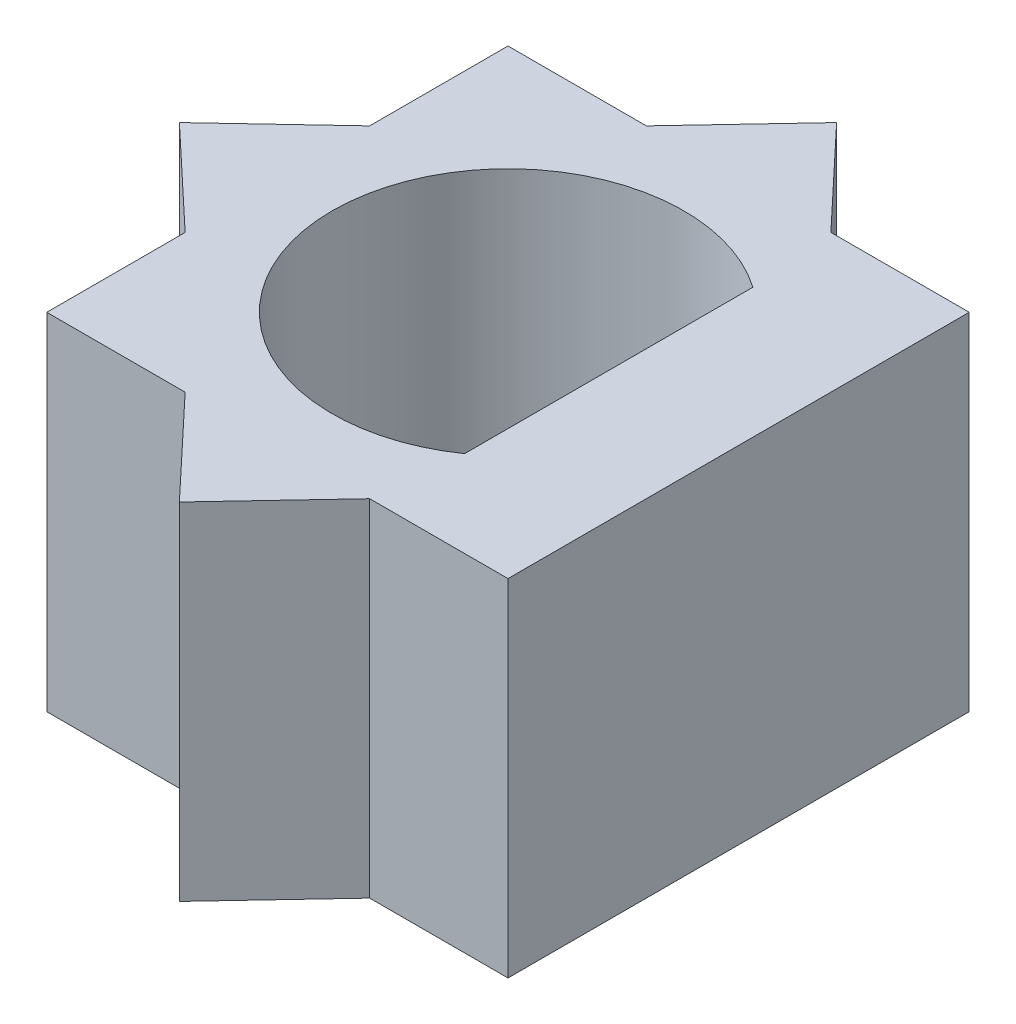
ISO-10303-21;
HEADER;
FILE_DESCRIPTION(('STEP AP214'),'2;1');
FILE_NAME('part.step','',(''),(''),'','','');
FILE_SCHEMA(('AUTOMOTIVE_DESIGN { 1 0 10303 214 1 1 1 1 }'));
ENDSEC;
DATA;
#1=APPLICATION_CONTEXT('core data for automotive mechanical design processes');
#2=APPLICATION_PROTOCOL_DEFINITION('international standard','automotive_design',2000,#1);
#3=PRODUCT_CONTEXT('',#1,'mechanical');
#4=PRODUCT('Part','Part','',(#3));
#5=PRODUCT_RELATED_PRODUCT_CATEGORY('part','',(#4));
#6=PRODUCT_DEFINITION_FORMATION('','',#4);
#7=PRODUCT_DEFINITION_CONTEXT('part definition',#1,'design');
#8=PRODUCT_DEFINITION('design','',#6,#7);
#9=PRODUCT_DEFINITION_SHAPE('','',#8);
#10=(LENGTH_UNIT() NAMED_UNIT(*) SI_UNIT(.MILLI.,.METRE.));
#11=(NAMED_UNIT(*) PLANE_ANGLE_UNIT() SI_UNIT($,.RADIAN.));
#12=(NAMED_UNIT(*) SI_UNIT($,.STERADIAN.) SOLID_ANGLE_UNIT());
#13=UNCERTAINTY_MEASURE_WITH_UNIT(LENGTH_MEASURE(1.E-05),#10,'distance_accuracy_value','');
#14=(GEOMETRIC_REPRESENTATION_CONTEXT(3) GLOBAL_UNCERTAINTY_ASSIGNED_CONTEXT((#13)) GLOBAL_UNIT_ASSIGNED_CONTEXT((#10,
#11,#12)) REPRESENTATION_CONTEXT('',''));
#15=CARTESIAN_POINT('',(0.,0.,0.));
#16=DIRECTION('',(0.,0.,1.));
#17=DIRECTION('',(1.,0.,0.));
#18=AXIS2_PLACEMENT_3D('',#15,#16,#17);
#19=CARTESIAN_POINT('',(-4.,6.,0.));
#20=DIRECTION('',(1.,0.,0.));
#21=DIRECTION('',(0.,0.,-1.));
#22=AXIS2_PLACEMENT_3D('',#19,#20,#21);
#23=PLANE('',#22);
#24=DIRECTION('',(0.,0.,1.));
#25=VECTOR('',#24,1.);
#26=CARTESIAN_POINT('',(-4.,0.,0.));
#27=LINE('',#26,#25);
#28=CARTESIAN_POINT('',(-4.00000000000003,0.,-3.99999999999992));
#29=VERTEX_POINT('',#28);
#30=CARTESIAN_POINT('',(-4.00000000000001,0.,-1.59999999999994));
#31=VERTEX_POINT('',#30);
#32=EDGE_CURVE('E185',#29,#31,#27,.T.);
#33=ORIENTED_EDGE('',*,*,#32,.T.);
#34=DIRECTION('',(0.,-1.,0.));
#35=VECTOR('',#34,1.);
#36=CARTESIAN_POINT('',(-4.00000000000001,6.,-1.59999999999994));
#37=LINE('',#36,#35);
#38=CARTESIAN_POINT('',(-4.00000000000001,6.,-1.59999999999994));
#39=VERTEX_POINT('',#38);
#40=EDGE_CURVE('E11',#39,#31,#37,.T.);
#41=ORIENTED_EDGE('',*,*,#40,.F.);
#42=DIRECTION('',(0.,0.,1.));
#43=VECTOR('',#42,1.);
#44=CARTESIAN_POINT('',(-4.,6.,0.));
#45=LINE('',#44,#43);
#46=CARTESIAN_POINT('',(-4.00000000000003,6.,-3.99999999999992));
#47=VERTEX_POINT('',#46);
#48=EDGE_CURVE('E236',#47,#39,#45,.T.);
#49=ORIENTED_EDGE('',*,*,#48,.F.);
#50=DIRECTION('',(0.,-1.,0.));
#51=VECTOR('',#50,1.);
#52=CARTESIAN_POINT('',(-4.00000000000003,6.,-3.99999999999992));
#53=LINE('',#52,#51);
#54=EDGE_CURVE('E56',#47,#29,#53,.T.);
#55=ORIENTED_EDGE('',*,*,#54,.T.);
#56=EDGE_LOOP('',(#33,#41,#49,#55));
#57=FACE_BOUND('',#56,.T.);
#58=ADVANCED_FACE('F37',(#57),#23,.F.);
#59=CARTESIAN_POINT('',(-2.67743119266045,6.,-2.84477064220183));
#60=DIRECTION('',(-0.685364699004978,0.,-0.728199992692815));
#61=DIRECTION('',(-0.728199992692815,0.,0.685364699004978));
#62=AXIS2_PLACEMENT_3D('',#59,#60,#61);
#63=PLANE('',#62);
#64=DIRECTION('',(0.728199992692815,0.,-0.685364699004978));
#65=VECTOR('',#64,1.);
#66=CARTESIAN_POINT('',(-2.67743119266045,0.,-2.84477064220183));
#67=LINE('',#66,#65);
#68=CARTESIAN_POINT('',(-5.70000000000001,0.,0.));
#69=VERTEX_POINT('',#68);
#70=EDGE_CURVE('E187',#69,#31,#67,.T.);
#71=ORIENTED_EDGE('',*,*,#70,.F.);
#72=DIRECTION('',(0.,-1.,0.));
#73=VECTOR('',#72,1.);
#74=CARTESIAN_POINT('',(-5.70000000000001,6.,0.));
#75=LINE('',#74,#73);
#76=CARTESIAN_POINT('',(-5.70000000000001,6.,0.));
#77=VERTEX_POINT('',#76);
#78=EDGE_CURVE('E47',#77,#69,#75,.T.);
#79=ORIENTED_EDGE('',*,*,#78,.F.);
#80=DIRECTION('',(0.728199992692815,0.,-0.685364699004978));
#81=VECTOR('',#80,1.);
#82=CARTESIAN_POINT('',(-2.67743119266045,6.,-2.84477064220183));
#83=LINE('',#82,#81);
#84=EDGE_CURVE('E239',#77,#39,#83,.T.);
#85=ORIENTED_EDGE('',*,*,#84,.T.);
#86=ORIENTED_EDGE('',*,*,#40,.T.);
#87=EDGE_LOOP('',(#71,#79,#85,#86));
#88=FACE_BOUND('',#87,.T.);
#89=ADVANCED_FACE('F245',(#88),#63,.T.);
#90=CARTESIAN_POINT('',(-2.67743119266062,6.,2.84477064220184));
#91=DIRECTION('',(0.685364699005,0.,-0.728199992692795));
#92=DIRECTION('',(-0.728199992692795,0.,-0.685364699005));
#93=AXIS2_PLACEMENT_3D('',#90,#91,#92);
#94=PLANE('',#93);
#95=DIRECTION('',(0.728199992692795,0.,0.685364699005));
#96=VECTOR('',#95,1.);
#97=CARTESIAN_POINT('',(-2.67743119266062,0.,2.84477064220184));
#98=LINE('',#97,#96);
#99=CARTESIAN_POINT('',(-3.99999999999999,0.,1.60000000000006));
#100=VERTEX_POINT('',#99);
#101=EDGE_CURVE('E191',#69,#100,#98,.T.);
#102=ORIENTED_EDGE('',*,*,#101,.T.);
#103=DIRECTION('',(0.,-1.,0.));
#104=VECTOR('',#103,1.);
#105=CARTESIAN_POINT('',(-3.99999999999999,6.,1.60000000000006));
#106=LINE('',#105,#104);
#107=CARTESIAN_POINT('',(-3.99999999999999,6.,1.60000000000006));
#108=VERTEX_POINT('',#107);
#109=EDGE_CURVE('E229',#108,#100,#106,.T.);
#110=ORIENTED_EDGE('',*,*,#109,.F.);
#111=DIRECTION('',(0.728199992692795,0.,0.685364699005));
#112=VECTOR('',#111,1.);
#113=CARTESIAN_POINT('',(-2.67743119266062,6.,2.84477064220184));
#114=LINE('',#113,#112);
#115=EDGE_CURVE('E247',#77,#108,#114,.T.);
#116=ORIENTED_EDGE('',*,*,#115,.F.);
#117=ORIENTED_EDGE('',*,*,#78,.T.);
#118=EDGE_LOOP('',(#102,#110,#116,#117));
#119=FACE_BOUND('',#118,.T.);
#120=ADVANCED_FACE('F295',(#119),#94,.F.);
#121=CARTESIAN_POINT('',(-3.99999999999997,0.,4.00000000000002));
#122=VERTEX_POINT('',#121);
#123=EDGE_CURVE('E188',#100,#122,#27,.T.);
#124=ORIENTED_EDGE('',*,*,#123,.T.);
#125=DIRECTION('',(0.,-1.,0.));
#126=VECTOR('',#125,1.);
#127=CARTESIAN_POINT('',(-3.99999999999997,6.,4.00000000000002));
#128=LINE('',#127,#126);
#129=CARTESIAN_POINT('',(-3.99999999999997,6.,4.00000000000002));
#130=VERTEX_POINT('',#129);
#131=EDGE_CURVE('E226',#130,#122,#128,.T.);
#132=ORIENTED_EDGE('',*,*,#131,.F.);
#133=EDGE_CURVE('E242',#108,#130,#45,.T.);
#134=ORIENTED_EDGE('',*,*,#133,.F.);
#135=ORIENTED_EDGE('',*,*,#109,.T.);
#136=EDGE_LOOP('',(#124,#132,#134,#135));
#137=FACE_BOUND('',#136,.T.);
#138=ADVANCED_FACE('F291',(#137),#23,.F.);
#139=CARTESIAN_POINT('',(0.,6.,4.00000000000001));
#140=DIRECTION('',(0.,0.,-1.));
#141=DIRECTION('',(-1.,0.,0.));
#142=AXIS2_PLACEMENT_3D('',#139,#140,#141);
#143=PLANE('',#142);
#144=DIRECTION('',(1.,0.,0.));
#145=VECTOR('',#144,1.);
#146=CARTESIAN_POINT('',(0.,0.,4.00000000000001));
#147=LINE('',#146,#145);
#148=CARTESIAN_POINT('',(-1.60000000000007,0.,4.00000000000001));
#149=VERTEX_POINT('',#148);
#150=EDGE_CURVE('E193',#122,#149,#147,.T.);
#151=ORIENTED_EDGE('',*,*,#150,.T.);
#152=DIRECTION('',(0.,-1.,0.));
#153=VECTOR('',#152,1.);
#154=CARTESIAN_POINT('',(-1.60000000000007,6.,4.00000000000001));
#155=LINE('',#154,#153);
#156=CARTESIAN_POINT('',(-1.60000000000007,6.,4.00000000000001));
#157=VERTEX_POINT('',#156);
#158=EDGE_CURVE('E224',#157,#149,#155,.T.);
#159=ORIENTED_EDGE('',*,*,#158,.F.);
#160=DIRECTION('',(1.,0.,0.));
#161=VECTOR('',#160,1.);
#162=CARTESIAN_POINT('',(0.,6.,4.00000000000001));
#163=LINE('',#162,#161);
#164=EDGE_CURVE('E252',#130,#157,#163,.T.);
#165=ORIENTED_EDGE('',*,*,#164,.F.);
#166=ORIENTED_EDGE('',*,*,#131,.T.);
#167=EDGE_LOOP('',(#151,#159,#165,#166));
#168=FACE_BOUND('',#167,.T.);
#169=ADVANCED_FACE('F300',(#168),#143,.F.);
#170=CARTESIAN_POINT('',(-2.84477064220186,6.,2.67743119266065));
#171=DIRECTION('',(-0.728199992692793,0.,0.685364699005001));
#172=DIRECTION('',(0.685364699005001,0.,0.728199992692793));
#173=AXIS2_PLACEMENT_3D('',#170,#171,#172);
#174=PLANE('',#173);
#175=DIRECTION('',(-0.685364699005001,0.,-0.728199992692794));
#176=VECTOR('',#175,1.);
#177=CARTESIAN_POINT('',(-2.84477064220186,0.,2.67743119266065));
#178=LINE('',#177,#176);
#179=CARTESIAN_POINT('',(0.,0.,5.70000000000005));
#180=VERTEX_POINT('',#179);
#181=EDGE_CURVE('E196',#180,#149,#178,.T.);
#182=ORIENTED_EDGE('',*,*,#181,.F.);
#183=DIRECTION('',(0.,-1.,0.));
#184=VECTOR('',#183,1.);
#185=CARTESIAN_POINT('',(0.,6.,5.70000000000005));
#186=LINE('',#185,#184);
#187=CARTESIAN_POINT('',(0.,6.,5.70000000000005));
#188=VERTEX_POINT('',#187);
#189=EDGE_CURVE('E222',#188,#180,#186,.T.);
#190=ORIENTED_EDGE('',*,*,#189,.F.);
#191=DIRECTION('',(-0.685364699005001,0.,-0.728199992692794));
#192=VECTOR('',#191,1.);
#193=CARTESIAN_POINT('',(-2.84477064220186,6.,2.67743119266065));
#194=LINE('',#193,#192);
#195=EDGE_CURVE('E254',#188,#157,#194,.T.);
#196=ORIENTED_EDGE('',*,*,#195,.T.);
#197=ORIENTED_EDGE('',*,*,#158,.T.);
#198=EDGE_LOOP('',(#182,#190,#196,#197));
#199=FACE_BOUND('',#198,.T.);
#200=ADVANCED_FACE('F306',(#199),#174,.T.);
#201=CARTESIAN_POINT('',(2.84477064220184,6.,2.67743119266033));
#202=DIRECTION('',(-0.728199992692832,0.,-0.685364699004959));
#203=DIRECTION('',(-0.68536469900496,0.,0.728199992692832));
#204=AXIS2_PLACEMENT_3D('',#201,#202,#203);
#205=PLANE('',#204);
#206=DIRECTION('',(0.68536469900496,0.,-0.728199992692832));
#207=VECTOR('',#206,1.);
#208=CARTESIAN_POINT('',(2.84477064220184,0.,2.67743119266033));
#209=LINE('',#208,#207);
#210=CARTESIAN_POINT('',(1.59999999999989,0.,4.00000000000001));
#211=VERTEX_POINT('',#210);
#212=EDGE_CURVE('E200',#180,#211,#209,.T.);
#213=ORIENTED_EDGE('',*,*,#212,.T.);
#214=DIRECTION('',(0.,-1.,0.));
#215=VECTOR('',#214,1.);
#216=CARTESIAN_POINT('',(1.59999999999989,6.,4.00000000000001));
#217=LINE('',#216,#215);
#218=CARTESIAN_POINT('',(1.59999999999989,6.,4.00000000000001));
#219=VERTEX_POINT('',#218);
#220=EDGE_CURVE('E219',#219,#211,#217,.T.);
#221=ORIENTED_EDGE('',*,*,#220,.F.);
#222=DIRECTION('',(0.68536469900496,0.,-0.728199992692832));
#223=VECTOR('',#222,1.);
#224=CARTESIAN_POINT('',(2.84477064220184,6.,2.67743119266033));
#225=LINE('',#224,#223);
#226=EDGE_CURVE('E258',#188,#219,#225,.T.);
#227=ORIENTED_EDGE('',*,*,#226,.F.);
#228=ORIENTED_EDGE('',*,*,#189,.T.);
#229=EDGE_LOOP('',(#213,#221,#227,#228));
#230=FACE_BOUND('',#229,.T.);
#231=ADVANCED_FACE('F338',(#230),#205,.F.);
#232=CARTESIAN_POINT('',(3.99999999999988,0.,4.00000000000001));
#233=VERTEX_POINT('',#232);
#234=EDGE_CURVE('E197',#211,#233,#147,.T.);
#235=ORIENTED_EDGE('',*,*,#234,.T.);
#236=DIRECTION('',(0.,-1.,0.));
#237=VECTOR('',#236,1.);
#238=CARTESIAN_POINT('',(3.99999999999988,6.,4.00000000000001));
#239=LINE('',#238,#237);
#240=CARTESIAN_POINT('',(3.99999999999988,6.,4.00000000000001));
#241=VERTEX_POINT('',#240);
#242=EDGE_CURVE('E217',#241,#233,#239,.T.);
#243=ORIENTED_EDGE('',*,*,#242,.F.);
#244=EDGE_CURVE('E255',#219,#241,#163,.T.);
#245=ORIENTED_EDGE('',*,*,#244,.F.);
#246=ORIENTED_EDGE('',*,*,#220,.T.);
#247=EDGE_LOOP('',(#235,#243,#245,#246));
#248=FACE_BOUND('',#247,.T.);
#249=ADVANCED_FACE('F268',(#248),#143,.F.);
#250=CARTESIAN_POINT('',(3.99999999999987,6.,0.));
#251=DIRECTION('',(1.,0.,0.));
#252=DIRECTION('',(0.,0.,-1.));
#253=AXIS2_PLACEMENT_3D('',#250,#251,#252);
#254=PLANE('',#253);
#255=DIRECTION('',(0.,0.,1.));
#256=VECTOR('',#255,1.);
#257=CARTESIAN_POINT('',(3.99999999999987,0.,0.));
#258=LINE('',#257,#256);
#259=CARTESIAN_POINT('',(3.99999999999987,0.,-3.99999999999992));
#260=VERTEX_POINT('',#259);
#261=EDGE_CURVE('E202',#260,#233,#258,.T.);
#262=ORIENTED_EDGE('',*,*,#261,.F.);
#263=DIRECTION('',(0.,-1.,0.));
#264=VECTOR('',#263,1.);
#265=CARTESIAN_POINT('',(3.99999999999987,6.,-3.99999999999992));
#266=LINE('',#265,#264);
#267=CARTESIAN_POINT('',(3.99999999999987,6.,-3.99999999999992));
#268=VERTEX_POINT('',#267);
#269=EDGE_CURVE('E215',#268,#260,#266,.T.);
#270=ORIENTED_EDGE('',*,*,#269,.F.);
#271=DIRECTION('',(0.,0.,1.));
#272=VECTOR('',#271,1.);
#273=CARTESIAN_POINT('',(3.99999999999987,6.,0.));
#274=LINE('',#273,#272);
#275=EDGE_CURVE('E175',#268,#241,#274,.T.);
#276=ORIENTED_EDGE('',*,*,#275,.T.);
#277=ORIENTED_EDGE('',*,*,#242,.T.);
#278=EDGE_LOOP('',(#262,#270,#276,#277));
#279=FACE_BOUND('',#278,.T.);
#280=ADVANCED_FACE('F271',(#279),#254,.T.);
#281=CARTESIAN_POINT('',(0.,6.,-3.99999999999992));
#282=DIRECTION('',(0.,0.,-1.));
#283=DIRECTION('',(-1.,0.,0.));
#284=AXIS2_PLACEMENT_3D('',#281,#282,#283);
#285=PLANE('',#284);
#286=DIRECTION('',(1.,0.,0.));
#287=VECTOR('',#286,1.);
#288=CARTESIAN_POINT('',(0.,0.,-3.99999999999992));
#289=LINE('',#288,#287);
#290=CARTESIAN_POINT('',(1.59999999999987,0.,-3.99999999999992));
#291=VERTEX_POINT('',#290);
#292=EDGE_CURVE('E205',#291,#260,#289,.T.);
#293=ORIENTED_EDGE('',*,*,#292,.F.);
#294=DIRECTION('',(0.,-1.,0.));
#295=VECTOR('',#294,1.);
#296=CARTESIAN_POINT('',(1.59999999999987,6.,-3.99999999999992));
#297=LINE('',#296,#295);
#298=CARTESIAN_POINT('',(1.59999999999987,6.,-3.99999999999992));
#299=VERTEX_POINT('',#298);
#300=EDGE_CURVE('E161',#299,#291,#297,.T.);
#301=ORIENTED_EDGE('',*,*,#300,.F.);
#302=DIRECTION('',(1.,0.,0.));
#303=VECTOR('',#302,1.);
#304=CARTESIAN_POINT('',(0.,6.,-3.99999999999992));
#305=LINE('',#304,#303);
#306=EDGE_CURVE('E173',#299,#268,#305,.T.);
#307=ORIENTED_EDGE('',*,*,#306,.T.);
#308=ORIENTED_EDGE('',*,*,#269,.T.);
#309=EDGE_LOOP('',(#293,#301,#307,#308));
#310=FACE_BOUND('',#309,.T.);
#311=ADVANCED_FACE('F276',(#310),#285,.T.);
#312=CARTESIAN_POINT('',(2.84477064220179,6.,-2.67743119266026));
#313=DIRECTION('',(0.728199992692835,0.,-0.685364699004956));
#314=DIRECTION('',(-0.685364699004956,0.,-0.728199992692836));
#315=AXIS2_PLACEMENT_3D('',#312,#313,#314);
#316=PLANE('',#315);
#317=DIRECTION('',(0.685364699004956,0.,0.728199992692836));
#318=VECTOR('',#317,1.);
#319=CARTESIAN_POINT('',(2.84477064220179,0.,-2.67743119266026));
#320=LINE('',#319,#318);
#321=CARTESIAN_POINT('',(0.,0.,-5.69999999999995));
#322=VERTEX_POINT('',#321);
#323=EDGE_CURVE('E158',#322,#291,#320,.T.);
#324=ORIENTED_EDGE('',*,*,#323,.F.);
#325=DIRECTION('',(0.,-1.,0.));
#326=VECTOR('',#325,1.);
#327=CARTESIAN_POINT('',(0.,6.,-5.69999999999995));
#328=LINE('',#327,#326);
#329=CARTESIAN_POINT('',(0.,6.,-5.69999999999995));
#330=VERTEX_POINT('',#329);
#331=EDGE_CURVE('E152',#330,#322,#328,.T.);
#332=ORIENTED_EDGE('',*,*,#331,.F.);
#333=DIRECTION('',(0.685364699004956,0.,0.728199992692836));
#334=VECTOR('',#333,1.);
#335=CARTESIAN_POINT('',(2.84477064220179,6.,-2.67743119266026));
#336=LINE('',#335,#334);
#337=EDGE_CURVE('E156',#330,#299,#336,.T.);
#338=ORIENTED_EDGE('',*,*,#337,.T.);
#339=ORIENTED_EDGE('',*,*,#300,.T.);
#340=EDGE_LOOP('',(#324,#332,#338,#339));
#341=FACE_BOUND('',#340,.T.);
#342=ADVANCED_FACE('F154',(#341),#316,.T.);
#343=CARTESIAN_POINT('',(-2.84477064220181,6.,-2.67743119266054));
#344=DIRECTION('',(0.728199992692802,0.,0.685364699004992));
#345=DIRECTION('',(0.685364699004992,0.,-0.728199992692802));
#346=AXIS2_PLACEMENT_3D('',#343,#344,#345);
#347=PLANE('',#346);
#348=DIRECTION('',(-0.685364699004992,0.,0.728199992692802));
#349=VECTOR('',#348,1.);
#350=CARTESIAN_POINT('',(-2.84477064220181,0.,-2.67743119266054));
#351=LINE('',#350,#349);
#352=CARTESIAN_POINT('',(-1.60000000000003,0.,-3.99999999999992));
#353=VERTEX_POINT('',#352);
#354=EDGE_CURVE('E210',#322,#353,#351,.T.);
#355=ORIENTED_EDGE('',*,*,#354,.T.);
#356=DIRECTION('',(0.,-1.,0.));
#357=VECTOR('',#356,1.);
#358=CARTESIAN_POINT('',(-1.60000000000003,6.,-3.99999999999992));
#359=LINE('',#358,#357);
#360=CARTESIAN_POINT('',(-1.60000000000003,6.,-3.99999999999992));
#361=VERTEX_POINT('',#360);
#362=EDGE_CURVE('E103',#361,#353,#359,.T.);
#363=ORIENTED_EDGE('',*,*,#362,.F.);
#364=DIRECTION('',(-0.685364699004992,0.,0.728199992692802));
#365=VECTOR('',#364,1.);
#366=CARTESIAN_POINT('',(-2.84477064220181,6.,-2.67743119266054));
#367=LINE('',#366,#365);
#368=EDGE_CURVE('E163',#330,#361,#367,.T.);
#369=ORIENTED_EDGE('',*,*,#368,.F.);
#370=ORIENTED_EDGE('',*,*,#331,.T.);
#371=EDGE_LOOP('',(#355,#363,#369,#370));
#372=FACE_BOUND('',#371,.T.);
#373=ADVANCED_FACE('F164',(#372),#347,.F.);
#374=CARTESIAN_POINT('',(0.,6.,0.));
#375=DIRECTION('',(0.,-1.,0.));
#376=DIRECTION('',(0.,0.,-1.));
#377=AXIS2_PLACEMENT_3D('',#374,#375,#376);
#378=CYLINDRICAL_SURFACE('',#377,3.05);
#379=CARTESIAN_POINT('',(0.,0.,0.));
#380=DIRECTION('',(0.,1.,0.));
#381=DIRECTION('',(0.,0.,1.));
#382=AXIS2_PLACEMENT_3D('',#379,#380,#381);
#383=CIRCLE('',#382,3.05);
#384=CARTESIAN_POINT('',(1.74714052096561,0.,-2.5));
#385=VERTEX_POINT('',#384);
#386=CARTESIAN_POINT('',(1.74714052096561,0.,2.5));
#387=VERTEX_POINT('',#386);
#388=EDGE_CURVE('E179',#385,#387,#383,.T.);
#389=ORIENTED_EDGE('',*,*,#388,.F.);
#390=DIRECTION('',(0.,-1.,0.));
#391=VECTOR('',#390,1.);
#392=CARTESIAN_POINT('',(1.74714052096561,6.,-2.5));
#393=LINE('',#392,#391);
#394=CARTESIAN_POINT('',(1.74714052096561,6.,-2.5));
#395=VERTEX_POINT('',#394);
#396=EDGE_CURVE('E41',#395,#385,#393,.T.);
#397=ORIENTED_EDGE('',*,*,#396,.F.);
#398=CARTESIAN_POINT('',(0.,6.,0.));
#399=DIRECTION('',(0.,1.,0.));
#400=DIRECTION('',(0.,0.,1.));
#401=AXIS2_PLACEMENT_3D('',#398,#399,#400);
#402=CIRCLE('',#401,3.05);
#403=CARTESIAN_POINT('',(1.74714052096561,6.,2.5));
#404=VERTEX_POINT('',#403);
#405=EDGE_CURVE('E322',#395,#404,#402,.T.);
#406=ORIENTED_EDGE('',*,*,#405,.T.);
#407=DIRECTION('',(0.,-1.,0.));
#408=VECTOR('',#407,1.);
#409=CARTESIAN_POINT('',(1.74714052096561,6.,2.5));
#410=LINE('',#409,#408);
#411=EDGE_CURVE('E232',#404,#387,#410,.T.);
#412=ORIENTED_EDGE('',*,*,#411,.T.);
#413=EDGE_LOOP('',(#389,#397,#406,#412));
#414=FACE_BOUND('',#413,.T.);
#415=ADVANCED_FACE('F39',(#414),#378,.F.);
#416=CARTESIAN_POINT('',(1.74714052096561,6.,0.));
#417=DIRECTION('',(1.,0.,0.));
#418=DIRECTION('',(0.,0.,-1.));
#419=AXIS2_PLACEMENT_3D('',#416,#417,#418);
#420=PLANE('',#419);
#421=DIRECTION('',(0.,0.,1.));
#422=VECTOR('',#421,1.);
#423=CARTESIAN_POINT('',(1.74714052096561,0.,0.));
#424=LINE('',#423,#422);
#425=EDGE_CURVE('E182',#385,#387,#424,.T.);
#426=ORIENTED_EDGE('',*,*,#425,.T.);
#427=ORIENTED_EDGE('',*,*,#411,.F.);
#428=DIRECTION('',(0.,0.,1.));
#429=VECTOR('',#428,1.);
#430=CARTESIAN_POINT('',(1.74714052096561,6.,0.));
#431=LINE('',#430,#429);
#432=EDGE_CURVE('E240',#395,#404,#431,.T.);
#433=ORIENTED_EDGE('',*,*,#432,.F.);
#434=ORIENTED_EDGE('',*,*,#396,.T.);
#435=EDGE_LOOP('',(#426,#427,#433,#434));
#436=FACE_BOUND('',#435,.T.);
#437=ADVANCED_FACE('F288',(#436),#420,.F.);
#438=EDGE_CURVE('E208',#29,#353,#289,.T.);
#439=ORIENTED_EDGE('',*,*,#438,.F.);
#440=ORIENTED_EDGE('',*,*,#54,.F.);
#441=EDGE_CURVE('E167',#47,#361,#305,.T.);
#442=ORIENTED_EDGE('',*,*,#441,.T.);
#443=ORIENTED_EDGE('',*,*,#362,.T.);
#444=EDGE_LOOP('',(#439,#440,#442,#443));
#445=FACE_BOUND('',#444,.T.);
#446=ADVANCED_FACE('F234',(#445),#285,.T.);
#447=CARTESIAN_POINT('',(0.,6.,0.));
#448=DIRECTION('',(0.,1.,0.));
#449=DIRECTION('',(0.,0.,1.));
#450=AXIS2_PLACEMENT_3D('',#447,#448,#449);
#451=PLANE('',#450);
#452=ORIENTED_EDGE('',*,*,#405,.F.);
#453=ORIENTED_EDGE('',*,*,#432,.T.);
#454=EDGE_LOOP('',(#452,#453));
#455=FACE_BOUND('',#454,.T.);
#456=ORIENTED_EDGE('',*,*,#48,.T.);
#457=ORIENTED_EDGE('',*,*,#84,.F.);
#458=ORIENTED_EDGE('',*,*,#115,.T.);
#459=ORIENTED_EDGE('',*,*,#133,.T.);
#460=ORIENTED_EDGE('',*,*,#164,.T.);
#461=ORIENTED_EDGE('',*,*,#195,.F.);
#462=ORIENTED_EDGE('',*,*,#226,.T.);
#463=ORIENTED_EDGE('',*,*,#244,.T.);
#464=ORIENTED_EDGE('',*,*,#275,.F.);
#465=ORIENTED_EDGE('',*,*,#306,.F.);
#466=ORIENTED_EDGE('',*,*,#337,.F.);
#467=ORIENTED_EDGE('',*,*,#368,.T.);
#468=ORIENTED_EDGE('',*,*,#441,.F.);
#469=EDGE_LOOP('',(#456,#457,#458,#459,#460,#461,#462,#463,#464,#465,#466,#467,#468));
#470=FACE_BOUND('',#469,.T.);
#471=ADVANCED_FACE('F170',(#455,#470),#451,.T.);
#472=CARTESIAN_POINT('',(0.,0.,0.));
#473=DIRECTION('',(0.,1.,0.));
#474=DIRECTION('',(0.,0.,1.));
#475=AXIS2_PLACEMENT_3D('',#472,#473,#474);
#476=PLANE('',#475);
#477=ORIENTED_EDGE('',*,*,#388,.T.);
#478=ORIENTED_EDGE('',*,*,#425,.F.);
#479=EDGE_LOOP('',(#477,#478));
#480=FACE_BOUND('',#479,.T.);
#481=ORIENTED_EDGE('',*,*,#32,.F.);
#482=ORIENTED_EDGE('',*,*,#438,.T.);
#483=ORIENTED_EDGE('',*,*,#354,.F.);
#484=ORIENTED_EDGE('',*,*,#323,.T.);
#485=ORIENTED_EDGE('',*,*,#292,.T.);
#486=ORIENTED_EDGE('',*,*,#261,.T.);
#487=ORIENTED_EDGE('',*,*,#234,.F.);
#488=ORIENTED_EDGE('',*,*,#212,.F.);
#489=ORIENTED_EDGE('',*,*,#181,.T.);
#490=ORIENTED_EDGE('',*,*,#150,.F.);
#491=ORIENTED_EDGE('',*,*,#123,.F.);
#492=ORIENTED_EDGE('',*,*,#101,.F.);
#493=ORIENTED_EDGE('',*,*,#70,.T.);
#494=EDGE_LOOP('',(#481,#482,#483,#484,#485,#486,#487,#488,#489,#490,#491,#492,#493));
#495=FACE_BOUND('',#494,.T.);
#496=ADVANCED_FACE('F274',(#480,#495),#476,.F.);
#497=CLOSED_SHELL('',(#58,#89,#120,#138,#169,#200,#231,#249,#280,#311,#342,#373,#415,#437,#446,
#471,#496));
#498=MANIFOLD_SOLID_BREP('B2',#497);
#499=ADVANCED_BREP_SHAPE_REPRESENTATION('',(#18,#498),#14);
#500=SHAPE_DEFINITION_REPRESENTATION(#9,#499);
ENDSEC;
END-ISO-10303-21;
